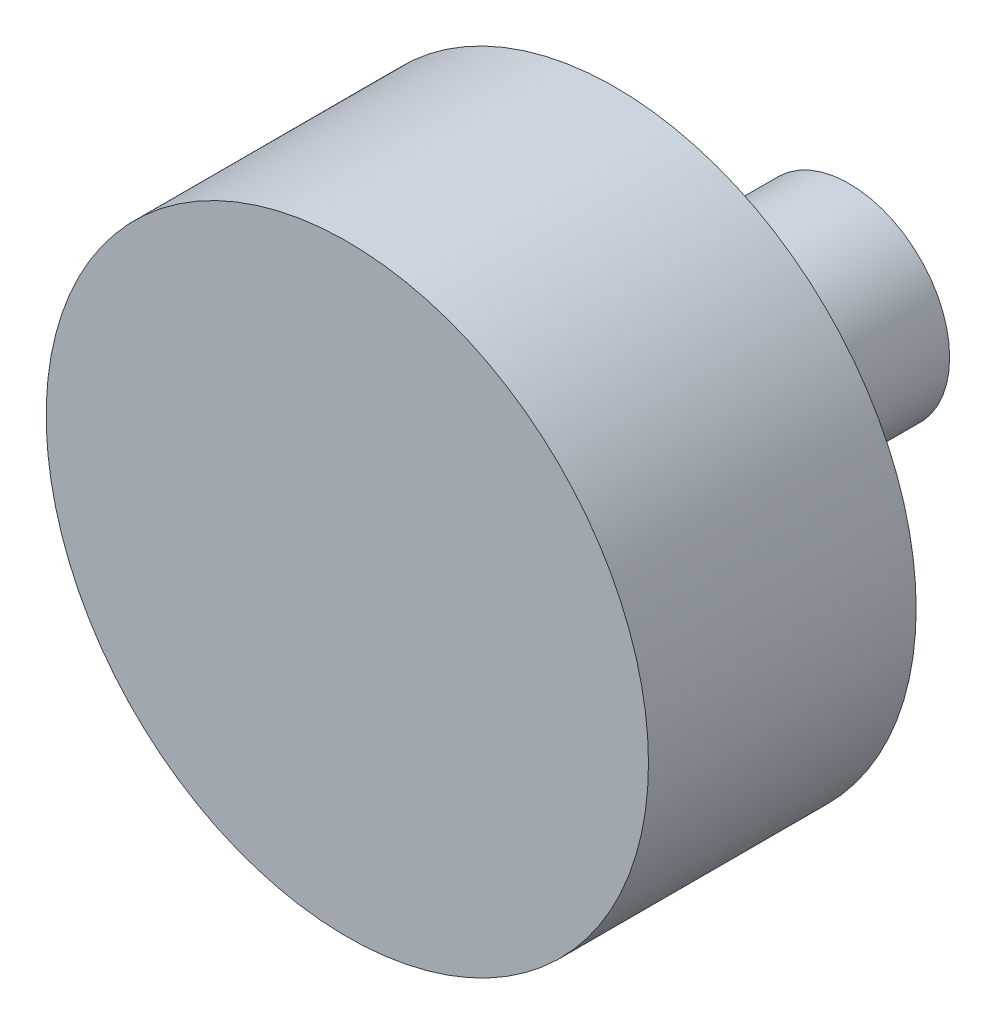
ISO-10303-21;
HEADER;
FILE_DESCRIPTION(('STEP AP214'),'2;1');
FILE_NAME('part.step','',(''),(''),'','','');
FILE_SCHEMA(('AUTOMOTIVE_DESIGN { 1 0 10303 214 1 1 1 1 }'));
ENDSEC;
DATA;
#1=APPLICATION_CONTEXT('core data for automotive mechanical design processes');
#2=APPLICATION_PROTOCOL_DEFINITION('international standard','automotive_design',2000,#1);
#3=PRODUCT_CONTEXT('',#1,'mechanical');
#4=PRODUCT('Part','Part','',(#3));
#5=PRODUCT_RELATED_PRODUCT_CATEGORY('part','',(#4));
#6=PRODUCT_DEFINITION_FORMATION('','',#4);
#7=PRODUCT_DEFINITION_CONTEXT('part definition',#1,'design');
#8=PRODUCT_DEFINITION('design','',#6,#7);
#9=PRODUCT_DEFINITION_SHAPE('','',#8);
#10=(LENGTH_UNIT() NAMED_UNIT(*) SI_UNIT(.MILLI.,.METRE.));
#11=(NAMED_UNIT(*) PLANE_ANGLE_UNIT() SI_UNIT($,.RADIAN.));
#12=(NAMED_UNIT(*) SI_UNIT($,.STERADIAN.) SOLID_ANGLE_UNIT());
#13=UNCERTAINTY_MEASURE_WITH_UNIT(LENGTH_MEASURE(1.E-05),#10,'distance_accuracy_value','');
#14=(GEOMETRIC_REPRESENTATION_CONTEXT(3) GLOBAL_UNCERTAINTY_ASSIGNED_CONTEXT((#13)) GLOBAL_UNIT_ASSIGNED_CONTEXT((#10,
#11,#12)) REPRESENTATION_CONTEXT('',''));
#15=CARTESIAN_POINT('',(0.,0.,0.));
#16=DIRECTION('',(0.,0.,1.));
#17=DIRECTION('',(1.,0.,0.));
#18=AXIS2_PLACEMENT_3D('',#15,#16,#17);
#19=CARTESIAN_POINT('',(0.,0.,-3.));
#20=DIRECTION('',(0.,0.,1.));
#21=DIRECTION('',(1.,0.,0.));
#22=AXIS2_PLACEMENT_3D('',#19,#20,#21);
#23=CYLINDRICAL_SURFACE('',#22,9.);
#24=CARTESIAN_POINT('',(0.,0.,-3.));
#25=DIRECTION('',(0.,0.,1.));
#26=DIRECTION('',(1.,0.,0.));
#27=AXIS2_PLACEMENT_3D('',#24,#25,#26);
#28=CIRCLE('',#27,9.);
#29=CARTESIAN_POINT('',(9.,0.,-3.));
#30=VERTEX_POINT('',#29);
#31=EDGE_CURVE('E10',#30,#30,#28,.T.);
#32=ORIENTED_EDGE('',*,*,#31,.T.);
#33=EDGE_LOOP('',(#32));
#34=FACE_BOUND('',#33,.T.);
#35=CARTESIAN_POINT('',(0.,0.,5.));
#36=DIRECTION('',(0.,0.,1.));
#37=DIRECTION('',(1.,0.,0.));
#38=AXIS2_PLACEMENT_3D('',#35,#36,#37);
#39=CIRCLE('',#38,9.);
#40=CARTESIAN_POINT('',(9.,0.,5.));
#41=VERTEX_POINT('',#40);
#42=EDGE_CURVE('E37',#41,#41,#39,.T.);
#43=ORIENTED_EDGE('',*,*,#42,.F.);
#44=EDGE_LOOP('',(#43));
#45=FACE_BOUND('',#44,.T.);
#46=ADVANCED_FACE('F30',(#34,#45),#23,.T.);
#47=CARTESIAN_POINT('',(0.,0.,-3.));
#48=DIRECTION('',(0.,0.,1.));
#49=DIRECTION('',(1.,0.,0.));
#50=AXIS2_PLACEMENT_3D('',#47,#48,#49);
#51=PLANE('',#50);
#52=CARTESIAN_POINT('',(0.,0.,-3.));
#53=DIRECTION('',(0.,0.,1.));
#54=DIRECTION('',(1.,0.,0.));
#55=AXIS2_PLACEMENT_3D('',#52,#53,#54);
#56=CIRCLE('',#55,6.);
#57=CARTESIAN_POINT('',(6.,0.,-3.));
#58=VERTEX_POINT('',#57);
#59=EDGE_CURVE('E33',#58,#58,#56,.T.);
#60=ORIENTED_EDGE('',*,*,#59,.T.);
#61=EDGE_LOOP('',(#60));
#62=FACE_BOUND('',#61,.T.);
#63=ORIENTED_EDGE('',*,*,#31,.F.);
#64=EDGE_LOOP('',(#63));
#65=FACE_BOUND('',#64,.T.);
#66=ADVANCED_FACE('F68',(#62,#65),#51,.F.);
#67=CARTESIAN_POINT('',(0.,0.,5.));
#68=DIRECTION('',(0.,0.,1.));
#69=DIRECTION('',(1.,0.,0.));
#70=AXIS2_PLACEMENT_3D('',#67,#68,#69);
#71=PLANE('',#70);
#72=ORIENTED_EDGE('',*,*,#42,.T.);
#73=EDGE_LOOP('',(#72));
#74=FACE_BOUND('',#73,.T.);
#75=ADVANCED_FACE('F72',(#74),#71,.T.);
#76=CARTESIAN_POINT('',(0.,0.,-10.));
#77=DIRECTION('',(0.,0.,1.));
#78=DIRECTION('',(1.,0.,0.));
#79=AXIS2_PLACEMENT_3D('',#76,#77,#78);
#80=CYLINDRICAL_SURFACE('',#79,6.);
#81=CARTESIAN_POINT('',(0.,0.,0.));
#82=DIRECTION('',(0.,0.,1.));
#83=DIRECTION('',(1.,0.,0.));
#84=AXIS2_PLACEMENT_3D('',#81,#82,#83);
#85=CIRCLE('',#84,6.);
#86=CARTESIAN_POINT('',(6.,0.,0.));
#87=VERTEX_POINT('',#86);
#88=EDGE_CURVE('E46',#87,#87,#85,.T.);
#89=ORIENTED_EDGE('',*,*,#88,.T.);
#90=EDGE_LOOP('',(#89));
#91=FACE_BOUND('',#90,.T.);
#92=ORIENTED_EDGE('',*,*,#59,.F.);
#93=EDGE_LOOP('',(#92));
#94=FACE_BOUND('',#93,.T.);
#95=ADVANCED_FACE('F78',(#91,#94),#80,.F.);
#96=CARTESIAN_POINT('',(0.,0.,0.));
#97=DIRECTION('',(0.,0.,1.));
#98=DIRECTION('',(1.,0.,0.));
#99=AXIS2_PLACEMENT_3D('',#96,#97,#98);
#100=PLANE('',#99);
#101=CARTESIAN_POINT('',(0.,0.,0.));
#102=DIRECTION('',(0.,0.,1.));
#103=DIRECTION('',(1.,0.,0.));
#104=AXIS2_PLACEMENT_3D('',#101,#102,#103);
#105=CIRCLE('',#104,3.);
#106=CARTESIAN_POINT('',(3.,0.,0.));
#107=VERTEX_POINT('',#106);
#108=EDGE_CURVE('E49',#107,#107,#105,.T.);
#109=ORIENTED_EDGE('',*,*,#108,.T.);
#110=EDGE_LOOP('',(#109));
#111=FACE_BOUND('',#110,.T.);
#112=ORIENTED_EDGE('',*,*,#88,.F.);
#113=EDGE_LOOP('',(#112));
#114=FACE_BOUND('',#113,.T.);
#115=ADVANCED_FACE('F53',(#111,#114),#100,.F.);
#116=CARTESIAN_POINT('',(0.,0.,-10.));
#117=DIRECTION('',(0.,0.,1.));
#118=DIRECTION('',(1.,0.,0.));
#119=AXIS2_PLACEMENT_3D('',#116,#117,#118);
#120=PLANE('',#119);
#121=CARTESIAN_POINT('',(0.,0.,-10.));
#122=DIRECTION('',(0.,0.,1.));
#123=DIRECTION('',(1.,0.,0.));
#124=AXIS2_PLACEMENT_3D('',#121,#122,#123);
#125=CIRCLE('',#124,3.);
#126=CARTESIAN_POINT('',(3.,0.,-10.));
#127=VERTEX_POINT('',#126);
#128=EDGE_CURVE('E41',#127,#127,#125,.T.);
#129=ORIENTED_EDGE('',*,*,#128,.F.);
#130=EDGE_LOOP('',(#129));
#131=FACE_BOUND('',#130,.T.);
#132=ADVANCED_FACE('F58',(#131),#120,.F.);
#133=CARTESIAN_POINT('',(0.,0.,-10.));
#134=DIRECTION('',(0.,0.,1.));
#135=DIRECTION('',(1.,0.,0.));
#136=AXIS2_PLACEMENT_3D('',#133,#134,#135);
#137=CYLINDRICAL_SURFACE('',#136,3.);
#138=ORIENTED_EDGE('',*,*,#128,.T.);
#139=EDGE_LOOP('',(#138));
#140=FACE_BOUND('',#139,.T.);
#141=ORIENTED_EDGE('',*,*,#108,.F.);
#142=EDGE_LOOP('',(#141));
#143=FACE_BOUND('',#142,.T.);
#144=ADVANCED_FACE('F56',(#140,#143),#137,.T.);
#145=CLOSED_SHELL('',(#46,#66,#75,#95,#115,#132,#144));
#146=MANIFOLD_SOLID_BREP('B2',#145);
#147=ADVANCED_BREP_SHAPE_REPRESENTATION('',(#18,#146),#14);
#148=SHAPE_DEFINITION_REPRESENTATION(#9,#147);
ENDSEC;
END-ISO-10303-21;
